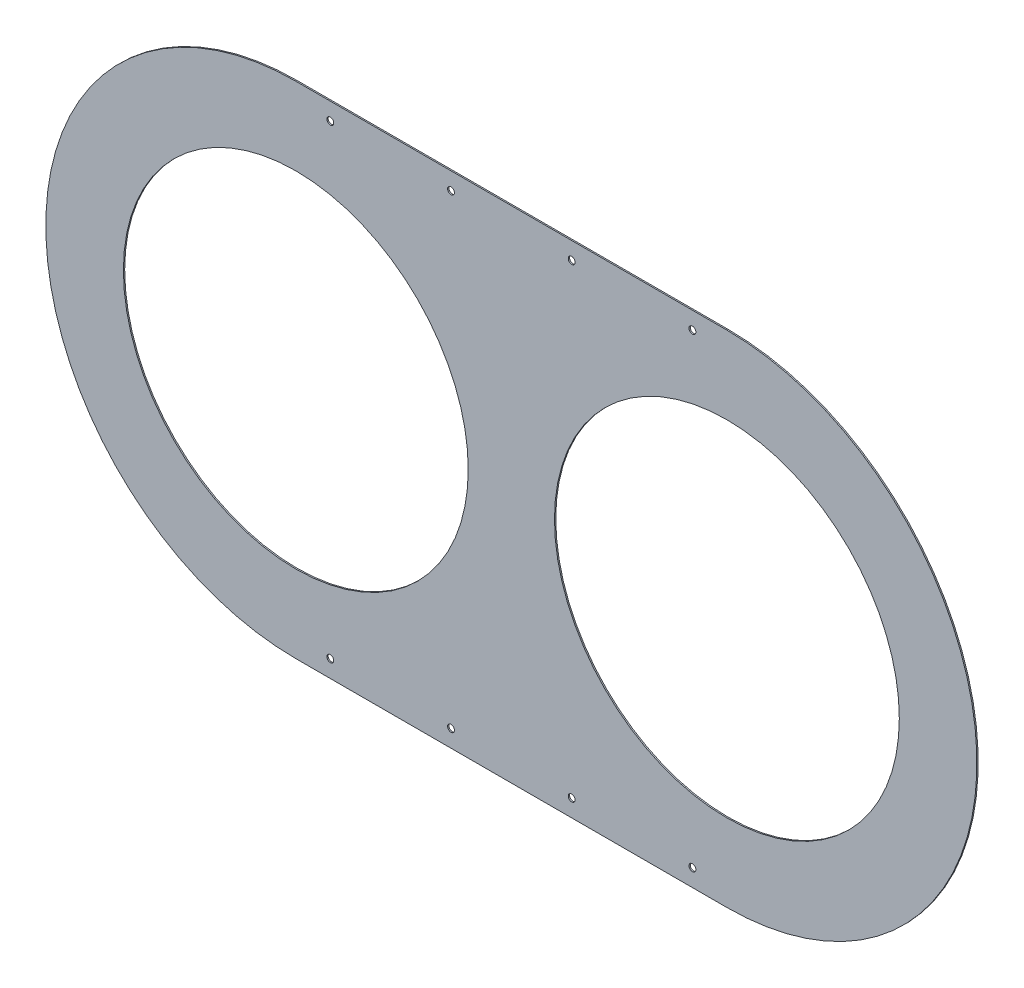
ISO-10303-21;
HEADER;
FILE_DESCRIPTION(('STEP AP214'),'2;1');
FILE_NAME('part.step','',(''),(''),'','','');
FILE_SCHEMA(('AUTOMOTIVE_DESIGN { 1 0 10303 214 1 1 1 1 }'));
ENDSEC;
DATA;
#1=APPLICATION_CONTEXT('core data for automotive mechanical design processes');
#2=APPLICATION_PROTOCOL_DEFINITION('international standard','automotive_design',2000,#1);
#3=PRODUCT_CONTEXT('',#1,'mechanical');
#4=PRODUCT('Part','Part','',(#3));
#5=PRODUCT_RELATED_PRODUCT_CATEGORY('part','',(#4));
#6=PRODUCT_DEFINITION_FORMATION('','',#4);
#7=PRODUCT_DEFINITION_CONTEXT('part definition',#1,'design');
#8=PRODUCT_DEFINITION('design','',#6,#7);
#9=PRODUCT_DEFINITION_SHAPE('','',#8);
#10=(LENGTH_UNIT() NAMED_UNIT(*) SI_UNIT(.MILLI.,.METRE.));
#11=(NAMED_UNIT(*) PLANE_ANGLE_UNIT() SI_UNIT($,.RADIAN.));
#12=(NAMED_UNIT(*) SI_UNIT($,.STERADIAN.) SOLID_ANGLE_UNIT());
#13=UNCERTAINTY_MEASURE_WITH_UNIT(LENGTH_MEASURE(1.E-05),#10,'distance_accuracy_value','');
#14=(GEOMETRIC_REPRESENTATION_CONTEXT(3) GLOBAL_UNCERTAINTY_ASSIGNED_CONTEXT((#13)) GLOBAL_UNIT_ASSIGNED_CONTEXT((#10,
#11,#12)) REPRESENTATION_CONTEXT('',''));
#15=CARTESIAN_POINT('',(0.,0.,0.));
#16=DIRECTION('',(0.,0.,1.));
#17=DIRECTION('',(1.,0.,0.));
#18=AXIS2_PLACEMENT_3D('',#15,#16,#17);
#19=CARTESIAN_POINT('',(-125.,0.,-0.75));
#20=DIRECTION('',(0.,0.,1.));
#21=DIRECTION('',(1.,0.,0.));
#22=AXIS2_PLACEMENT_3D('',#19,#20,#21);
#23=CYLINDRICAL_SURFACE('',#22,145.);
#24=CARTESIAN_POINT('',(-125.,0.,0.));
#25=DIRECTION('',(0.,0.,1.));
#26=DIRECTION('',(1.,0.,0.));
#27=AXIS2_PLACEMENT_3D('',#24,#25,#26);
#28=CIRCLE('',#27,145.);
#29=CARTESIAN_POINT('',(-125.,145.,0.));
#30=VERTEX_POINT('',#29);
#31=CARTESIAN_POINT('',(-125.,-145.,0.));
#32=VERTEX_POINT('',#31);
#33=EDGE_CURVE('E102',#30,#32,#28,.T.);
#34=ORIENTED_EDGE('',*,*,#33,.F.);
#35=DIRECTION('',(0.,0.,1.));
#36=VECTOR('',#35,1.);
#37=CARTESIAN_POINT('',(-125.,145.,-0.75));
#38=LINE('',#37,#36);
#39=CARTESIAN_POINT('',(-125.,145.,-0.75));
#40=VERTEX_POINT('',#39);
#41=EDGE_CURVE('E11',#40,#30,#38,.T.);
#42=ORIENTED_EDGE('',*,*,#41,.F.);
#43=CARTESIAN_POINT('',(-125.,0.,-0.75));
#44=DIRECTION('',(0.,0.,1.));
#45=DIRECTION('',(1.,0.,0.));
#46=AXIS2_PLACEMENT_3D('',#43,#44,#45);
#47=CIRCLE('',#46,145.);
#48=CARTESIAN_POINT('',(-125.,-145.,-0.75));
#49=VERTEX_POINT('',#48);
#50=EDGE_CURVE('E95',#40,#49,#47,.T.);
#51=ORIENTED_EDGE('',*,*,#50,.T.);
#52=DIRECTION('',(0.,0.,1.));
#53=VECTOR('',#52,1.);
#54=CARTESIAN_POINT('',(-125.,-145.,-0.75));
#55=LINE('',#54,#53);
#56=EDGE_CURVE('E78',#49,#32,#55,.T.);
#57=ORIENTED_EDGE('',*,*,#56,.T.);
#58=EDGE_LOOP('',(#34,#42,#51,#57));
#59=FACE_BOUND('',#58,.T.);
#60=ADVANCED_FACE('F35',(#59),#23,.T.);
#61=CARTESIAN_POINT('',(-125.,145.,-0.75));
#62=DIRECTION('',(0.,1.,0.));
#63=DIRECTION('',(0.,0.,1.));
#64=AXIS2_PLACEMENT_3D('',#61,#62,#63);
#65=PLANE('',#64);
#66=DIRECTION('',(-1.,0.,0.));
#67=VECTOR('',#66,1.);
#68=CARTESIAN_POINT('',(-125.,145.,0.));
#69=LINE('',#68,#67);
#70=CARTESIAN_POINT('',(125.,145.,0.));
#71=VERTEX_POINT('',#70);
#72=EDGE_CURVE('E97',#71,#30,#69,.T.);
#73=ORIENTED_EDGE('',*,*,#72,.F.);
#74=DIRECTION('',(0.,0.,1.));
#75=VECTOR('',#74,1.);
#76=CARTESIAN_POINT('',(125.,145.,-0.75));
#77=LINE('',#76,#75);
#78=CARTESIAN_POINT('',(125.,145.,-0.75));
#79=VERTEX_POINT('',#78);
#80=EDGE_CURVE('E44',#79,#71,#77,.T.);
#81=ORIENTED_EDGE('',*,*,#80,.F.);
#82=DIRECTION('',(-1.,0.,0.));
#83=VECTOR('',#82,1.);
#84=CARTESIAN_POINT('',(-125.,145.,-0.75));
#85=LINE('',#84,#83);
#86=EDGE_CURVE('E92',#79,#40,#85,.T.);
#87=ORIENTED_EDGE('',*,*,#86,.T.);
#88=ORIENTED_EDGE('',*,*,#41,.T.);
#89=EDGE_LOOP('',(#73,#81,#87,#88));
#90=FACE_BOUND('',#89,.T.);
#91=ADVANCED_FACE('F113',(#90),#65,.T.);
#92=CARTESIAN_POINT('',(125.,0.,-0.75));
#93=DIRECTION('',(0.,0.,1.));
#94=DIRECTION('',(1.,0.,0.));
#95=AXIS2_PLACEMENT_3D('',#92,#93,#94);
#96=CYLINDRICAL_SURFACE('',#95,145.);
#97=CARTESIAN_POINT('',(125.,0.,0.));
#98=DIRECTION('',(0.,0.,1.));
#99=DIRECTION('',(1.,0.,0.));
#100=AXIS2_PLACEMENT_3D('',#97,#98,#99);
#101=CIRCLE('',#100,145.);
#102=CARTESIAN_POINT('',(125.,-145.,0.));
#103=VERTEX_POINT('',#102);
#104=EDGE_CURVE('E86',#103,#71,#101,.T.);
#105=ORIENTED_EDGE('',*,*,#104,.F.);
#106=DIRECTION('',(0.,0.,1.));
#107=VECTOR('',#106,1.);
#108=CARTESIAN_POINT('',(125.,-145.,-0.75));
#109=LINE('',#108,#107);
#110=CARTESIAN_POINT('',(125.,-145.,-0.75));
#111=VERTEX_POINT('',#110);
#112=EDGE_CURVE('E81',#111,#103,#109,.T.);
#113=ORIENTED_EDGE('',*,*,#112,.F.);
#114=CARTESIAN_POINT('',(125.,0.,-0.75));
#115=DIRECTION('',(0.,0.,1.));
#116=DIRECTION('',(1.,0.,0.));
#117=AXIS2_PLACEMENT_3D('',#114,#115,#116);
#118=CIRCLE('',#117,145.);
#119=EDGE_CURVE('E84',#111,#79,#118,.T.);
#120=ORIENTED_EDGE('',*,*,#119,.T.);
#121=ORIENTED_EDGE('',*,*,#80,.T.);
#122=EDGE_LOOP('',(#105,#113,#120,#121));
#123=FACE_BOUND('',#122,.T.);
#124=ADVANCED_FACE('F83',(#123),#96,.T.);
#125=CARTESIAN_POINT('',(-125.,-145.,-0.75));
#126=DIRECTION('',(0.,-1.,0.));
#127=DIRECTION('',(0.,0.,-1.));
#128=AXIS2_PLACEMENT_3D('',#125,#126,#127);
#129=PLANE('',#128);
#130=DIRECTION('',(1.,0.,0.));
#131=VECTOR('',#130,1.);
#132=CARTESIAN_POINT('',(-125.,-145.,0.));
#133=LINE('',#132,#131);
#134=EDGE_CURVE('E105',#32,#103,#133,.T.);
#135=ORIENTED_EDGE('',*,*,#134,.F.);
#136=ORIENTED_EDGE('',*,*,#56,.F.);
#137=DIRECTION('',(1.,0.,0.));
#138=VECTOR('',#137,1.);
#139=CARTESIAN_POINT('',(-125.,-145.,-0.75));
#140=LINE('',#139,#138);
#141=EDGE_CURVE('E91',#49,#111,#140,.T.);
#142=ORIENTED_EDGE('',*,*,#141,.T.);
#143=ORIENTED_EDGE('',*,*,#112,.T.);
#144=EDGE_LOOP('',(#135,#136,#142,#143));
#145=FACE_BOUND('',#144,.T.);
#146=ADVANCED_FACE('F94',(#145),#129,.T.);
#147=CARTESIAN_POINT('',(-125.,0.,-0.75));
#148=DIRECTION('',(0.,0.,1.));
#149=DIRECTION('',(1.,0.,0.));
#150=AXIS2_PLACEMENT_3D('',#147,#148,#149);
#151=PLANE('',#150);
#152=CARTESIAN_POINT('',(-105.,135.,-0.75));
#153=DIRECTION('',(0.,0.,1.));
#154=DIRECTION('',(1.,0.,0.));
#155=AXIS2_PLACEMENT_3D('',#152,#153,#154);
#156=CIRCLE('',#155,1.99999999999999);
#157=CARTESIAN_POINT('',(-103.,135.,-0.75));
#158=VERTEX_POINT('',#157);
#159=EDGE_CURVE('E181',#158,#158,#156,.T.);
#160=ORIENTED_EDGE('',*,*,#159,.T.);
#161=EDGE_LOOP('',(#160));
#162=FACE_BOUND('',#161,.T.);
#163=CARTESIAN_POINT('',(35.,135.,-0.75));
#164=DIRECTION('',(0.,0.,1.));
#165=DIRECTION('',(1.,0.,0.));
#166=AXIS2_PLACEMENT_3D('',#163,#164,#165);
#167=CIRCLE('',#166,1.99999999999999);
#168=CARTESIAN_POINT('',(37.,135.,-0.75));
#169=VERTEX_POINT('',#168);
#170=EDGE_CURVE('E185',#169,#169,#167,.T.);
#171=ORIENTED_EDGE('',*,*,#170,.T.);
#172=EDGE_LOOP('',(#171));
#173=FACE_BOUND('',#172,.T.);
#174=CARTESIAN_POINT('',(-35.,135.,-0.75));
#175=DIRECTION('',(0.,0.,1.));
#176=DIRECTION('',(1.,0.,0.));
#177=AXIS2_PLACEMENT_3D('',#174,#175,#176);
#178=CIRCLE('',#177,1.99999999999999);
#179=CARTESIAN_POINT('',(-33.,135.,-0.75));
#180=VERTEX_POINT('',#179);
#181=EDGE_CURVE('E38',#180,#180,#178,.T.);
#182=ORIENTED_EDGE('',*,*,#181,.T.);
#183=EDGE_LOOP('',(#182));
#184=FACE_BOUND('',#183,.T.);
#185=CARTESIAN_POINT('',(105.,135.,-0.75));
#186=DIRECTION('',(0.,0.,1.));
#187=DIRECTION('',(1.,0.,0.));
#188=AXIS2_PLACEMENT_3D('',#185,#186,#187);
#189=CIRCLE('',#188,1.99999999999999);
#190=CARTESIAN_POINT('',(107.,135.,-0.75));
#191=VERTEX_POINT('',#190);
#192=EDGE_CURVE('E197',#191,#191,#189,.T.);
#193=ORIENTED_EDGE('',*,*,#192,.T.);
#194=EDGE_LOOP('',(#193));
#195=FACE_BOUND('',#194,.T.);
#196=CARTESIAN_POINT('',(105.,-135.,-0.75));
#197=DIRECTION('',(0.,0.,1.));
#198=DIRECTION('',(1.,0.,0.));
#199=AXIS2_PLACEMENT_3D('',#196,#197,#198);
#200=CIRCLE('',#199,1.99999999999999);
#201=CARTESIAN_POINT('',(107.,-135.,-0.75));
#202=VERTEX_POINT('',#201);
#203=EDGE_CURVE('E203',#202,#202,#200,.T.);
#204=ORIENTED_EDGE('',*,*,#203,.T.);
#205=EDGE_LOOP('',(#204));
#206=FACE_BOUND('',#205,.T.);
#207=CARTESIAN_POINT('',(35.,-135.,-0.75));
#208=DIRECTION('',(0.,0.,1.));
#209=DIRECTION('',(1.,0.,0.));
#210=AXIS2_PLACEMENT_3D('',#207,#208,#209);
#211=CIRCLE('',#210,1.99999999999999);
#212=CARTESIAN_POINT('',(37.,-135.,-0.75));
#213=VERTEX_POINT('',#212);
#214=EDGE_CURVE('E209',#213,#213,#211,.T.);
#215=ORIENTED_EDGE('',*,*,#214,.T.);
#216=EDGE_LOOP('',(#215));
#217=FACE_BOUND('',#216,.T.);
#218=CARTESIAN_POINT('',(-35.,-135.,-0.75));
#219=DIRECTION('',(0.,0.,1.));
#220=DIRECTION('',(1.,0.,0.));
#221=AXIS2_PLACEMENT_3D('',#218,#219,#220);
#222=CIRCLE('',#221,1.99999999999999);
#223=CARTESIAN_POINT('',(-33.,-135.,-0.75));
#224=VERTEX_POINT('',#223);
#225=EDGE_CURVE('E215',#224,#224,#222,.T.);
#226=ORIENTED_EDGE('',*,*,#225,.T.);
#227=EDGE_LOOP('',(#226));
#228=FACE_BOUND('',#227,.T.);
#229=CARTESIAN_POINT('',(-105.,-135.,-0.75));
#230=DIRECTION('',(0.,0.,1.));
#231=DIRECTION('',(1.,0.,0.));
#232=AXIS2_PLACEMENT_3D('',#229,#230,#231);
#233=CIRCLE('',#232,1.99999999999999);
#234=CARTESIAN_POINT('',(-103.,-135.,-0.75));
#235=VERTEX_POINT('',#234);
#236=EDGE_CURVE('E221',#235,#235,#233,.T.);
#237=ORIENTED_EDGE('',*,*,#236,.T.);
#238=EDGE_LOOP('',(#237));
#239=FACE_BOUND('',#238,.T.);
#240=CARTESIAN_POINT('',(125.,0.,-0.75));
#241=DIRECTION('',(0.,0.,1.));
#242=DIRECTION('',(1.,0.,0.));
#243=AXIS2_PLACEMENT_3D('',#240,#241,#242);
#244=CIRCLE('',#243,100.);
#245=CARTESIAN_POINT('',(225.,0.,-0.75));
#246=VERTEX_POINT('',#245);
#247=EDGE_CURVE('E225',#246,#246,#244,.T.);
#248=ORIENTED_EDGE('',*,*,#247,.T.);
#249=EDGE_LOOP('',(#248));
#250=FACE_BOUND('',#249,.T.);
#251=CARTESIAN_POINT('',(-125.,0.,-0.75));
#252=DIRECTION('',(0.,0.,1.));
#253=DIRECTION('',(1.,0.,0.));
#254=AXIS2_PLACEMENT_3D('',#251,#252,#253);
#255=CIRCLE('',#254,100.);
#256=CARTESIAN_POINT('',(-25.,0.,-0.75));
#257=VERTEX_POINT('',#256);
#258=EDGE_CURVE('E106',#257,#257,#255,.T.);
#259=ORIENTED_EDGE('',*,*,#258,.T.);
#260=EDGE_LOOP('',(#259));
#261=FACE_BOUND('',#260,.T.);
#262=ORIENTED_EDGE('',*,*,#50,.F.);
#263=ORIENTED_EDGE('',*,*,#86,.F.);
#264=ORIENTED_EDGE('',*,*,#119,.F.);
#265=ORIENTED_EDGE('',*,*,#141,.F.);
#266=EDGE_LOOP('',(#262,#263,#264,#265));
#267=FACE_BOUND('',#266,.T.);
#268=ADVANCED_FACE('F90',(#162,#173,#184,#195,#206,#217,#228,#239,#250,#261,#267),#151,.F.);
#269=CARTESIAN_POINT('',(-125.,0.,0.));
#270=DIRECTION('',(0.,0.,1.));
#271=DIRECTION('',(1.,0.,0.));
#272=AXIS2_PLACEMENT_3D('',#269,#270,#271);
#273=PLANE('',#272);
#274=CARTESIAN_POINT('',(-105.,135.,0.));
#275=DIRECTION('',(0.,0.,1.));
#276=DIRECTION('',(1.,0.,0.));
#277=AXIS2_PLACEMENT_3D('',#274,#275,#276);
#278=CIRCLE('',#277,1.99999999999999);
#279=CARTESIAN_POINT('',(-103.,135.,0.));
#280=VERTEX_POINT('',#279);
#281=EDGE_CURVE('E179',#280,#280,#278,.T.);
#282=ORIENTED_EDGE('',*,*,#281,.F.);
#283=EDGE_LOOP('',(#282));
#284=FACE_BOUND('',#283,.T.);
#285=CARTESIAN_POINT('',(35.,135.,0.));
#286=DIRECTION('',(0.,0.,1.));
#287=DIRECTION('',(1.,0.,0.));
#288=AXIS2_PLACEMENT_3D('',#285,#286,#287);
#289=CIRCLE('',#288,1.99999999999999);
#290=CARTESIAN_POINT('',(37.,135.,0.));
#291=VERTEX_POINT('',#290);
#292=EDGE_CURVE('E182',#291,#291,#289,.T.);
#293=ORIENTED_EDGE('',*,*,#292,.F.);
#294=EDGE_LOOP('',(#293));
#295=FACE_BOUND('',#294,.T.);
#296=CARTESIAN_POINT('',(-35.,135.,0.));
#297=DIRECTION('',(0.,0.,1.));
#298=DIRECTION('',(1.,0.,0.));
#299=AXIS2_PLACEMENT_3D('',#296,#297,#298);
#300=CIRCLE('',#299,1.99999999999999);
#301=CARTESIAN_POINT('',(-33.,135.,0.));
#302=VERTEX_POINT('',#301);
#303=EDGE_CURVE('E191',#302,#302,#300,.T.);
#304=ORIENTED_EDGE('',*,*,#303,.F.);
#305=EDGE_LOOP('',(#304));
#306=FACE_BOUND('',#305,.T.);
#307=CARTESIAN_POINT('',(105.,135.,0.));
#308=DIRECTION('',(0.,0.,1.));
#309=DIRECTION('',(1.,0.,0.));
#310=AXIS2_PLACEMENT_3D('',#307,#308,#309);
#311=CIRCLE('',#310,1.99999999999999);
#312=CARTESIAN_POINT('',(107.,135.,0.));
#313=VERTEX_POINT('',#312);
#314=EDGE_CURVE('E194',#313,#313,#311,.T.);
#315=ORIENTED_EDGE('',*,*,#314,.F.);
#316=EDGE_LOOP('',(#315));
#317=FACE_BOUND('',#316,.T.);
#318=CARTESIAN_POINT('',(105.,-135.,0.));
#319=DIRECTION('',(0.,0.,1.));
#320=DIRECTION('',(1.,0.,0.));
#321=AXIS2_PLACEMENT_3D('',#318,#319,#320);
#322=CIRCLE('',#321,1.99999999999999);
#323=CARTESIAN_POINT('',(107.,-135.,0.));
#324=VERTEX_POINT('',#323);
#325=EDGE_CURVE('E200',#324,#324,#322,.T.);
#326=ORIENTED_EDGE('',*,*,#325,.F.);
#327=EDGE_LOOP('',(#326));
#328=FACE_BOUND('',#327,.T.);
#329=CARTESIAN_POINT('',(35.,-135.,0.));
#330=DIRECTION('',(0.,0.,1.));
#331=DIRECTION('',(1.,0.,0.));
#332=AXIS2_PLACEMENT_3D('',#329,#330,#331);
#333=CIRCLE('',#332,1.99999999999999);
#334=CARTESIAN_POINT('',(37.,-135.,0.));
#335=VERTEX_POINT('',#334);
#336=EDGE_CURVE('E206',#335,#335,#333,.T.);
#337=ORIENTED_EDGE('',*,*,#336,.F.);
#338=EDGE_LOOP('',(#337));
#339=FACE_BOUND('',#338,.T.);
#340=CARTESIAN_POINT('',(-35.,-135.,0.));
#341=DIRECTION('',(0.,0.,1.));
#342=DIRECTION('',(1.,0.,0.));
#343=AXIS2_PLACEMENT_3D('',#340,#341,#342);
#344=CIRCLE('',#343,1.99999999999999);
#345=CARTESIAN_POINT('',(-33.,-135.,0.));
#346=VERTEX_POINT('',#345);
#347=EDGE_CURVE('E212',#346,#346,#344,.T.);
#348=ORIENTED_EDGE('',*,*,#347,.F.);
#349=EDGE_LOOP('',(#348));
#350=FACE_BOUND('',#349,.T.);
#351=CARTESIAN_POINT('',(-105.,-135.,0.));
#352=DIRECTION('',(0.,0.,1.));
#353=DIRECTION('',(1.,0.,0.));
#354=AXIS2_PLACEMENT_3D('',#351,#352,#353);
#355=CIRCLE('',#354,1.99999999999999);
#356=CARTESIAN_POINT('',(-103.,-135.,0.));
#357=VERTEX_POINT('',#356);
#358=EDGE_CURVE('E218',#357,#357,#355,.T.);
#359=ORIENTED_EDGE('',*,*,#358,.F.);
#360=EDGE_LOOP('',(#359));
#361=FACE_BOUND('',#360,.T.);
#362=CARTESIAN_POINT('',(125.,0.,0.));
#363=DIRECTION('',(0.,0.,1.));
#364=DIRECTION('',(1.,0.,0.));
#365=AXIS2_PLACEMENT_3D('',#362,#363,#364);
#366=CIRCLE('',#365,100.);
#367=CARTESIAN_POINT('',(225.,0.,0.));
#368=VERTEX_POINT('',#367);
#369=EDGE_CURVE('E224',#368,#368,#366,.T.);
#370=ORIENTED_EDGE('',*,*,#369,.F.);
#371=EDGE_LOOP('',(#370));
#372=FACE_BOUND('',#371,.T.);
#373=CARTESIAN_POINT('',(-125.,0.,0.));
#374=DIRECTION('',(0.,0.,1.));
#375=DIRECTION('',(1.,0.,0.));
#376=AXIS2_PLACEMENT_3D('',#373,#374,#375);
#377=CIRCLE('',#376,100.);
#378=CARTESIAN_POINT('',(-25.,0.,0.));
#379=VERTEX_POINT('',#378);
#380=EDGE_CURVE('E228',#379,#379,#377,.T.);
#381=ORIENTED_EDGE('',*,*,#380,.F.);
#382=EDGE_LOOP('',(#381));
#383=FACE_BOUND('',#382,.T.);
#384=ORIENTED_EDGE('',*,*,#33,.T.);
#385=ORIENTED_EDGE('',*,*,#134,.T.);
#386=ORIENTED_EDGE('',*,*,#104,.T.);
#387=ORIENTED_EDGE('',*,*,#72,.T.);
#388=EDGE_LOOP('',(#384,#385,#386,#387));
#389=FACE_BOUND('',#388,.T.);
#390=ADVANCED_FACE('F112',(#284,#295,#306,#317,#328,#339,#350,#361,#372,#383,#389),#273,.T.);
#391=CARTESIAN_POINT('',(-125.,0.,-0.75));
#392=DIRECTION('',(0.,0.,1.));
#393=DIRECTION('',(1.,0.,0.));
#394=AXIS2_PLACEMENT_3D('',#391,#392,#393);
#395=CYLINDRICAL_SURFACE('',#394,100.);
#396=ORIENTED_EDGE('',*,*,#258,.F.);
#397=EDGE_LOOP('',(#396));
#398=FACE_BOUND('',#397,.T.);
#399=ORIENTED_EDGE('',*,*,#380,.T.);
#400=EDGE_LOOP('',(#399));
#401=FACE_BOUND('',#400,.T.);
#402=ADVANCED_FACE('F131',(#398,#401),#395,.F.);
#403=CARTESIAN_POINT('',(125.,0.,-0.75));
#404=DIRECTION('',(0.,0.,1.));
#405=DIRECTION('',(1.,0.,0.));
#406=AXIS2_PLACEMENT_3D('',#403,#404,#405);
#407=CYLINDRICAL_SURFACE('',#406,100.);
#408=ORIENTED_EDGE('',*,*,#247,.F.);
#409=EDGE_LOOP('',(#408));
#410=FACE_BOUND('',#409,.T.);
#411=ORIENTED_EDGE('',*,*,#369,.T.);
#412=EDGE_LOOP('',(#411));
#413=FACE_BOUND('',#412,.T.);
#414=ADVANCED_FACE('F138',(#410,#413),#407,.F.);
#415=CARTESIAN_POINT('',(-105.,-135.,0.));
#416=DIRECTION('',(0.,0.,1.));
#417=DIRECTION('',(1.,0.,0.));
#418=AXIS2_PLACEMENT_3D('',#415,#416,#417);
#419=CYLINDRICAL_SURFACE('',#418,1.99999999999999);
#420=ORIENTED_EDGE('',*,*,#358,.T.);
#421=EDGE_LOOP('',(#420));
#422=FACE_BOUND('',#421,.T.);
#423=ORIENTED_EDGE('',*,*,#236,.F.);
#424=EDGE_LOOP('',(#423));
#425=FACE_BOUND('',#424,.T.);
#426=ADVANCED_FACE('F142',(#422,#425),#419,.F.);
#427=CARTESIAN_POINT('',(-35.,-135.,0.));
#428=DIRECTION('',(0.,0.,1.));
#429=DIRECTION('',(1.,0.,0.));
#430=AXIS2_PLACEMENT_3D('',#427,#428,#429);
#431=CYLINDRICAL_SURFACE('',#430,1.99999999999999);
#432=ORIENTED_EDGE('',*,*,#347,.T.);
#433=EDGE_LOOP('',(#432));
#434=FACE_BOUND('',#433,.T.);
#435=ORIENTED_EDGE('',*,*,#225,.F.);
#436=EDGE_LOOP('',(#435));
#437=FACE_BOUND('',#436,.T.);
#438=ADVANCED_FACE('F146',(#434,#437),#431,.F.);
#439=CARTESIAN_POINT('',(35.,-135.,0.));
#440=DIRECTION('',(0.,0.,1.));
#441=DIRECTION('',(1.,0.,0.));
#442=AXIS2_PLACEMENT_3D('',#439,#440,#441);
#443=CYLINDRICAL_SURFACE('',#442,1.99999999999999);
#444=ORIENTED_EDGE('',*,*,#336,.T.);
#445=EDGE_LOOP('',(#444));
#446=FACE_BOUND('',#445,.T.);
#447=ORIENTED_EDGE('',*,*,#214,.F.);
#448=EDGE_LOOP('',(#447));
#449=FACE_BOUND('',#448,.T.);
#450=ADVANCED_FACE('F150',(#446,#449),#443,.F.);
#451=CARTESIAN_POINT('',(105.,-135.,0.));
#452=DIRECTION('',(0.,0.,1.));
#453=DIRECTION('',(1.,0.,0.));
#454=AXIS2_PLACEMENT_3D('',#451,#452,#453);
#455=CYLINDRICAL_SURFACE('',#454,1.99999999999999);
#456=ORIENTED_EDGE('',*,*,#325,.T.);
#457=EDGE_LOOP('',(#456));
#458=FACE_BOUND('',#457,.T.);
#459=ORIENTED_EDGE('',*,*,#203,.F.);
#460=EDGE_LOOP('',(#459));
#461=FACE_BOUND('',#460,.T.);
#462=ADVANCED_FACE('F154',(#458,#461),#455,.F.);
#463=CARTESIAN_POINT('',(105.,135.,0.));
#464=DIRECTION('',(0.,0.,1.));
#465=DIRECTION('',(1.,0.,0.));
#466=AXIS2_PLACEMENT_3D('',#463,#464,#465);
#467=CYLINDRICAL_SURFACE('',#466,1.99999999999999);
#468=ORIENTED_EDGE('',*,*,#314,.T.);
#469=EDGE_LOOP('',(#468));
#470=FACE_BOUND('',#469,.T.);
#471=ORIENTED_EDGE('',*,*,#192,.F.);
#472=EDGE_LOOP('',(#471));
#473=FACE_BOUND('',#472,.T.);
#474=ADVANCED_FACE('F158',(#470,#473),#467,.F.);
#475=CARTESIAN_POINT('',(-35.,135.,0.));
#476=DIRECTION('',(0.,0.,1.));
#477=DIRECTION('',(1.,0.,0.));
#478=AXIS2_PLACEMENT_3D('',#475,#476,#477);
#479=CYLINDRICAL_SURFACE('',#478,1.99999999999999);
#480=ORIENTED_EDGE('',*,*,#303,.T.);
#481=EDGE_LOOP('',(#480));
#482=FACE_BOUND('',#481,.T.);
#483=ORIENTED_EDGE('',*,*,#181,.F.);
#484=EDGE_LOOP('',(#483));
#485=FACE_BOUND('',#484,.T.);
#486=ADVANCED_FACE('F162',(#482,#485),#479,.F.);
#487=CARTESIAN_POINT('',(35.,135.,0.));
#488=DIRECTION('',(0.,0.,1.));
#489=DIRECTION('',(1.,0.,0.));
#490=AXIS2_PLACEMENT_3D('',#487,#488,#489);
#491=CYLINDRICAL_SURFACE('',#490,1.99999999999999);
#492=ORIENTED_EDGE('',*,*,#292,.T.);
#493=EDGE_LOOP('',(#492));
#494=FACE_BOUND('',#493,.T.);
#495=ORIENTED_EDGE('',*,*,#170,.F.);
#496=EDGE_LOOP('',(#495));
#497=FACE_BOUND('',#496,.T.);
#498=ADVANCED_FACE('F166',(#494,#497),#491,.F.);
#499=CARTESIAN_POINT('',(-105.,135.,0.));
#500=DIRECTION('',(0.,0.,1.));
#501=DIRECTION('',(1.,0.,0.));
#502=AXIS2_PLACEMENT_3D('',#499,#500,#501);
#503=CYLINDRICAL_SURFACE('',#502,1.99999999999999);
#504=ORIENTED_EDGE('',*,*,#281,.T.);
#505=EDGE_LOOP('',(#504));
#506=FACE_BOUND('',#505,.T.);
#507=ORIENTED_EDGE('',*,*,#159,.F.);
#508=EDGE_LOOP('',(#507));
#509=FACE_BOUND('',#508,.T.);
#510=ADVANCED_FACE('F170',(#506,#509),#503,.F.);
#511=CLOSED_SHELL('',(#60,#91,#124,#146,#268,#390,#402,#414,#426,#438,#450,#462,#474,#486,#498,#510));
#512=MANIFOLD_SOLID_BREP('B2',#511);
#513=ADVANCED_BREP_SHAPE_REPRESENTATION('',(#18,#512),#14);
#514=SHAPE_DEFINITION_REPRESENTATION(#9,#513);
ENDSEC;
END-ISO-10303-21;
